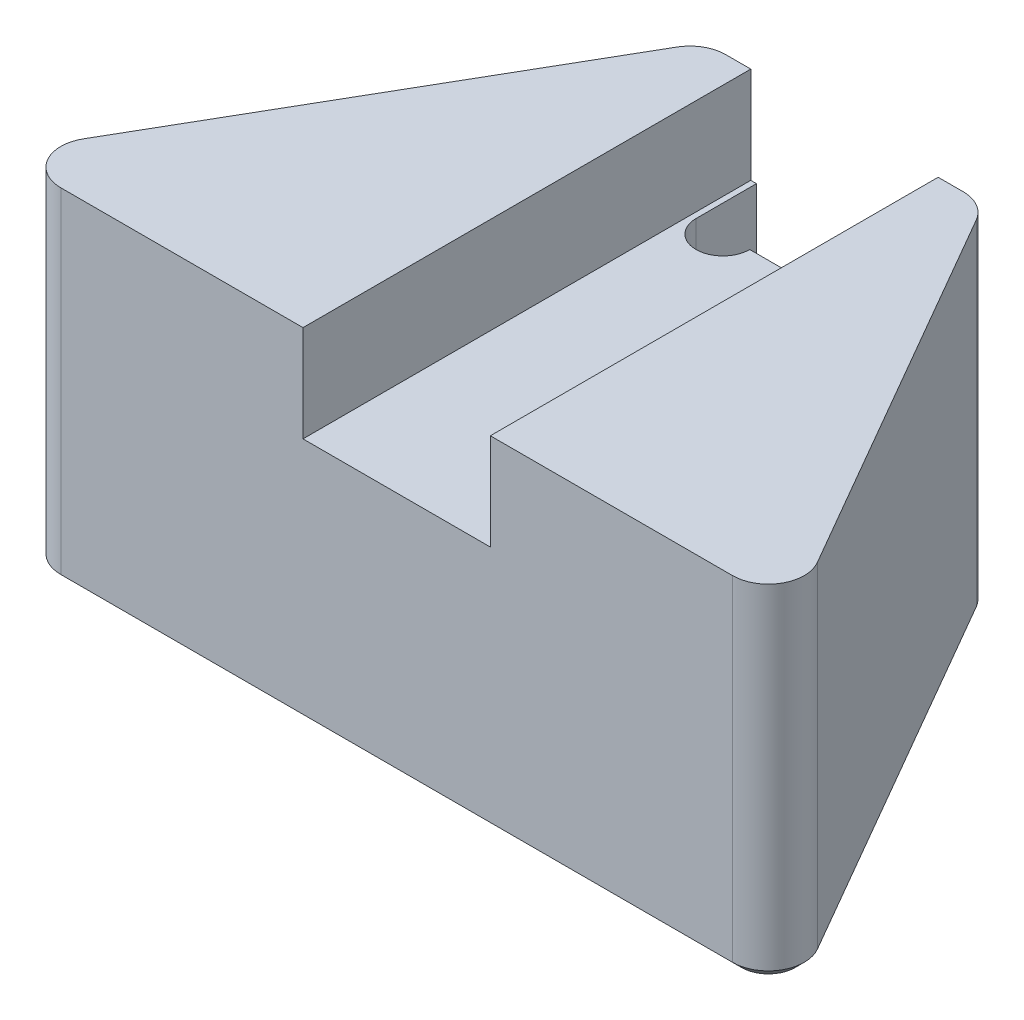
ISO-10303-21;
HEADER;
FILE_DESCRIPTION(('STEP AP214'),'2;1');
FILE_NAME('part.step','',(''),(''),'','','');
FILE_SCHEMA(('AUTOMOTIVE_DESIGN { 1 0 10303 214 1 1 1 1 }'));
ENDSEC;
DATA;
#1=APPLICATION_CONTEXT('core data for automotive mechanical design processes');
#2=APPLICATION_PROTOCOL_DEFINITION('international standard','automotive_design',2000,#1);
#3=PRODUCT_CONTEXT('',#1,'mechanical');
#4=PRODUCT('Part','Part','',(#3));
#5=PRODUCT_RELATED_PRODUCT_CATEGORY('part','',(#4));
#6=PRODUCT_DEFINITION_FORMATION('','',#4);
#7=PRODUCT_DEFINITION_CONTEXT('part definition',#1,'design');
#8=PRODUCT_DEFINITION('design','',#6,#7);
#9=PRODUCT_DEFINITION_SHAPE('','',#8);
#10=(LENGTH_UNIT() NAMED_UNIT(*) SI_UNIT(.MILLI.,.METRE.));
#11=(NAMED_UNIT(*) PLANE_ANGLE_UNIT() SI_UNIT($,.RADIAN.));
#12=(NAMED_UNIT(*) SI_UNIT($,.STERADIAN.) SOLID_ANGLE_UNIT());
#13=UNCERTAINTY_MEASURE_WITH_UNIT(LENGTH_MEASURE(1.E-05),#10,'distance_accuracy_value','');
#14=(GEOMETRIC_REPRESENTATION_CONTEXT(3) GLOBAL_UNCERTAINTY_ASSIGNED_CONTEXT((#13)) GLOBAL_UNIT_ASSIGNED_CONTEXT((#10,
#11,#12)) REPRESENTATION_CONTEXT('',''));
#15=CARTESIAN_POINT('',(0.,0.,0.));
#16=DIRECTION('',(0.,0.,1.));
#17=DIRECTION('',(1.,0.,0.));
#18=AXIS2_PLACEMENT_3D('',#15,#16,#17);
#19=CARTESIAN_POINT('',(0.,9.6,0.));
#20=DIRECTION('',(0.,-1.,0.));
#21=DIRECTION('',(0.,0.,-1.));
#22=AXIS2_PLACEMENT_3D('',#19,#20,#21);
#23=PLANE('',#22);
#24=DIRECTION('',(1.,0.,0.));
#25=VECTOR('',#24,1.);
#26=CARTESIAN_POINT('',(-22.2168783648704,9.6,12.5));
#27=LINE('',#26,#25);
#28=CARTESIAN_POINT('',(-18.7527767497326,9.6,12.5));
#29=VERTEX_POINT('',#28);
#30=CARTESIAN_POINT('',(-5.23,9.6,12.5));
#31=VERTEX_POINT('',#30);
#32=EDGE_CURVE('E250',#29,#31,#27,.T.);
#33=ORIENTED_EDGE('',*,*,#32,.T.);
#34=DIRECTION('',(0.,0.,1.));
#35=VECTOR('',#34,1.);
#36=CARTESIAN_POINT('',(-5.23,9.6,-12.5));
#37=LINE('',#36,#35);
#38=CARTESIAN_POINT('',(-5.23,9.6,-12.5));
#39=VERTEX_POINT('',#38);
#40=EDGE_CURVE('E241',#39,#31,#37,.T.);
#41=ORIENTED_EDGE('',*,*,#40,.F.);
#42=DIRECTION('',(-1.,0.,0.));
#43=VECTOR('',#42,1.);
#44=CARTESIAN_POINT('',(-7.7831216351296,9.6,-12.5));
#45=LINE('',#44,#43);
#46=CARTESIAN_POINT('',(-6.62842109675035,9.6,-12.5));
#47=VERTEX_POINT('',#46);
#48=EDGE_CURVE('E256',#39,#47,#45,.T.);
#49=ORIENTED_EDGE('',*,*,#48,.T.);
#50=CARTESIAN_POINT('',(-6.62842109675035,9.6,-10.5));
#51=DIRECTION('',(0.,-1.,0.));
#52=DIRECTION('',(0.,0.,-1.));
#53=AXIS2_PLACEMENT_3D('',#50,#51,#52);
#54=CIRCLE('',#53,2.);
#55=CARTESIAN_POINT('',(-8.36047190431923,9.6,-11.5));
#56=VERTEX_POINT('',#55);
#57=EDGE_CURVE('E277',#47,#56,#54,.F.);
#58=ORIENTED_EDGE('',*,*,#57,.T.);
#59=DIRECTION('',(-0.500000000000004,0.,0.866025403784436));
#60=VECTOR('',#59,1.);
#61=CARTESIAN_POINT('',(-7.7831216351296,9.6,-12.5));
#62=LINE('',#61,#60);
#63=CARTESIAN_POINT('',(-20.4848275573015,9.6,9.49999999999999));
#64=VERTEX_POINT('',#63);
#65=EDGE_CURVE('E260',#56,#64,#62,.T.);
#66=ORIENTED_EDGE('',*,*,#65,.T.);
#67=CARTESIAN_POINT('',(-18.7527767497326,9.6,10.5));
#68=DIRECTION('',(0.,-1.,0.));
#69=DIRECTION('',(0.,0.,-1.));
#70=AXIS2_PLACEMENT_3D('',#67,#68,#69);
#71=CIRCLE('',#70,2.);
#72=EDGE_CURVE('E271',#64,#29,#71,.F.);
#73=ORIENTED_EDGE('',*,*,#72,.T.);
#74=EDGE_LOOP('',(#33,#41,#49,#58,#66,#73));
#75=FACE_BOUND('',#74,.T.);
#76=ADVANCED_FACE('F37',(#75),#23,.F.);
#77=CARTESIAN_POINT('',(22.2168783648704,9.6,12.5));
#78=DIRECTION('',(0.,0.,-1.));
#79=DIRECTION('',(-1.,0.,0.));
#80=AXIS2_PLACEMENT_3D('',#77,#78,#79);
#81=PLANE('',#80);
#82=DIRECTION('',(0.,-1.,0.));
#83=VECTOR('',#82,1.);
#84=CARTESIAN_POINT('',(-18.7527767497326,9.6,12.5));
#85=LINE('',#84,#83);
#86=CARTESIAN_POINT('',(-18.7527767497326,-9.1,12.5));
#87=VERTEX_POINT('',#86);
#88=EDGE_CURVE('E284',#29,#87,#85,.T.);
#89=ORIENTED_EDGE('',*,*,#88,.T.);
#90=DIRECTION('',(1.,0.,0.));
#91=VECTOR('',#90,1.);
#92=CARTESIAN_POINT('',(18.7527767497326,-9.1,12.5));
#93=LINE('',#92,#91);
#94=CARTESIAN_POINT('',(18.7527767497326,-9.1,12.5));
#95=VERTEX_POINT('',#94);
#96=EDGE_CURVE('E313',#87,#95,#93,.T.);
#97=ORIENTED_EDGE('',*,*,#96,.T.);
#98=DIRECTION('',(0.,-1.,0.));
#99=VECTOR('',#98,1.);
#100=CARTESIAN_POINT('',(18.7527767497326,9.6,12.5));
#101=LINE('',#100,#99);
#102=CARTESIAN_POINT('',(18.7527767497326,9.6,12.5));
#103=VERTEX_POINT('',#102);
#104=EDGE_CURVE('E287',#95,#103,#101,.F.);
#105=ORIENTED_EDGE('',*,*,#104,.T.);
#106=CARTESIAN_POINT('',(5.23,9.6,12.5));
#107=VERTEX_POINT('',#106);
#108=EDGE_CURVE('E243',#107,#103,#27,.T.);
#109=ORIENTED_EDGE('',*,*,#108,.F.);
#110=DIRECTION('',(0.,1.,0.));
#111=VECTOR('',#110,1.);
#112=CARTESIAN_POINT('',(5.23,9.6,12.5));
#113=LINE('',#112,#111);
#114=CARTESIAN_POINT('',(5.23,4.22,12.5));
#115=VERTEX_POINT('',#114);
#116=EDGE_CURVE('E228',#115,#107,#113,.T.);
#117=ORIENTED_EDGE('',*,*,#116,.F.);
#118=DIRECTION('',(1.,0.,0.));
#119=VECTOR('',#118,1.);
#120=CARTESIAN_POINT('',(-5.23,4.22,12.5));
#121=LINE('',#120,#119);
#122=CARTESIAN_POINT('',(-5.23,4.22,12.5));
#123=VERTEX_POINT('',#122);
#124=EDGE_CURVE('E237',#123,#115,#121,.T.);
#125=ORIENTED_EDGE('',*,*,#124,.F.);
#126=DIRECTION('',(0.,-1.,0.));
#127=VECTOR('',#126,1.);
#128=CARTESIAN_POINT('',(-5.23,9.6,12.5));
#129=LINE('',#128,#127);
#130=EDGE_CURVE('E217',#31,#123,#129,.T.);
#131=ORIENTED_EDGE('',*,*,#130,.F.);
#132=ORIENTED_EDGE('',*,*,#32,.F.);
#133=EDGE_LOOP('',(#89,#97,#105,#109,#117,#125,#131,#132));
#134=FACE_BOUND('',#133,.T.);
#135=ADVANCED_FACE('F416',(#134),#81,.F.);
#136=CARTESIAN_POINT('',(7.7831216351296,9.6,-12.5));
#137=DIRECTION('',(-0.866025403784436,0.,0.500000000000004));
#138=DIRECTION('',(0.500000000000004,0.,0.866025403784436));
#139=AXIS2_PLACEMENT_3D('',#136,#137,#138);
#140=PLANE('',#139);
#141=DIRECTION('',(0.,-1.,0.));
#142=VECTOR('',#141,1.);
#143=CARTESIAN_POINT('',(20.4848275573015,9.6,9.5));
#144=LINE('',#143,#142);
#145=CARTESIAN_POINT('',(20.4848275573015,9.6,9.49999999999999));
#146=VERTEX_POINT('',#145);
#147=CARTESIAN_POINT('',(20.4848275573015,-9.1,9.5));
#148=VERTEX_POINT('',#147);
#149=EDGE_CURVE('E279',#146,#148,#144,.T.);
#150=ORIENTED_EDGE('',*,*,#149,.T.);
#151=DIRECTION('',(-0.500000000000004,0.,-0.866025403784436));
#152=VECTOR('',#151,1.);
#153=CARTESIAN_POINT('',(8.36047190431923,-9.1,-11.5));
#154=LINE('',#153,#152);
#155=CARTESIAN_POINT('',(8.36047190431923,-9.1,-11.5));
#156=VERTEX_POINT('',#155);
#157=EDGE_CURVE('E317',#148,#156,#154,.T.);
#158=ORIENTED_EDGE('',*,*,#157,.T.);
#159=DIRECTION('',(0.,-1.,0.));
#160=VECTOR('',#159,1.);
#161=CARTESIAN_POINT('',(8.36047190431923,9.6,-11.5));
#162=LINE('',#161,#160);
#163=CARTESIAN_POINT('',(8.36047190431923,9.6,-11.5));
#164=VERTEX_POINT('',#163);
#165=EDGE_CURVE('E282',#156,#164,#162,.F.);
#166=ORIENTED_EDGE('',*,*,#165,.T.);
#167=DIRECTION('',(-0.500000000000004,0.,-0.866025403784436));
#168=VECTOR('',#167,1.);
#169=CARTESIAN_POINT('',(7.7831216351296,9.6,-12.5));
#170=LINE('',#169,#168);
#171=EDGE_CURVE('E253',#146,#164,#170,.T.);
#172=ORIENTED_EDGE('',*,*,#171,.F.);
#173=EDGE_LOOP('',(#150,#158,#166,#172));
#174=FACE_BOUND('',#173,.T.);
#175=ADVANCED_FACE('F369',(#174),#140,.F.);
#176=CARTESIAN_POINT('',(-7.7831216351296,9.6,-12.5));
#177=DIRECTION('',(0.,0.,1.));
#178=DIRECTION('',(1.,0.,0.));
#179=AXIS2_PLACEMENT_3D('',#176,#177,#178);
#180=PLANE('',#179);
#181=DIRECTION('',(0.,-1.,0.));
#182=VECTOR('',#181,1.);
#183=CARTESIAN_POINT('',(6.62842109675036,9.6,-12.5));
#184=LINE('',#183,#182);
#185=CARTESIAN_POINT('',(6.62842109675036,9.6,-12.5));
#186=VERTEX_POINT('',#185);
#187=CARTESIAN_POINT('',(6.62842109675036,-9.1,-12.5));
#188=VERTEX_POINT('',#187);
#189=EDGE_CURVE('E267',#186,#188,#184,.T.);
#190=ORIENTED_EDGE('',*,*,#189,.T.);
#191=DIRECTION('',(-1.,0.,0.));
#192=VECTOR('',#191,1.);
#193=CARTESIAN_POINT('',(-6.62842109675035,-9.1,-12.5));
#194=LINE('',#193,#192);
#195=CARTESIAN_POINT('',(-6.62842109675035,-9.1,-12.5));
#196=VERTEX_POINT('',#195);
#197=EDGE_CURVE('E61',#188,#196,#194,.T.);
#198=ORIENTED_EDGE('',*,*,#197,.T.);
#199=DIRECTION('',(0.,-1.,0.));
#200=VECTOR('',#199,1.);
#201=CARTESIAN_POINT('',(-6.62842109675035,9.6,-12.5));
#202=LINE('',#201,#200);
#203=EDGE_CURVE('E269',#196,#47,#202,.F.);
#204=ORIENTED_EDGE('',*,*,#203,.T.);
#205=ORIENTED_EDGE('',*,*,#48,.F.);
#206=DIRECTION('',(0.,-1.,0.));
#207=VECTOR('',#206,1.);
#208=CARTESIAN_POINT('',(-5.23,9.6,-12.5));
#209=LINE('',#208,#207);
#210=CARTESIAN_POINT('',(-5.23,4.22,-12.5));
#211=VERTEX_POINT('',#210);
#212=EDGE_CURVE('E224',#39,#211,#209,.T.);
#213=ORIENTED_EDGE('',*,*,#212,.T.);
#214=DIRECTION('',(1.,0.,0.));
#215=VECTOR('',#214,1.);
#216=CARTESIAN_POINT('',(-5.23,4.22,-12.5));
#217=LINE('',#216,#215);
#218=CARTESIAN_POINT('',(-4.9125,4.22,-12.5));
#219=VERTEX_POINT('',#218);
#220=EDGE_CURVE('E229',#211,#219,#217,.T.);
#221=ORIENTED_EDGE('',*,*,#220,.T.);
#222=DIRECTION('',(0.,1.,0.));
#223=VECTOR('',#222,1.);
#224=CARTESIAN_POINT('',(-4.9125,4.22,-12.5));
#225=LINE('',#224,#223);
#226=CARTESIAN_POINT('',(-4.9125,-5.605,-12.5));
#227=VERTEX_POINT('',#226);
#228=EDGE_CURVE('E213',#227,#219,#225,.T.);
#229=ORIENTED_EDGE('',*,*,#228,.F.);
#230=DIRECTION('',(-1.,0.,0.));
#231=VECTOR('',#230,1.);
#232=CARTESIAN_POINT('',(4.9125,-5.60499999999998,-12.5));
#233=LINE('',#232,#231);
#234=CARTESIAN_POINT('',(4.9125,-5.60499999999998,-12.5));
#235=VERTEX_POINT('',#234);
#236=EDGE_CURVE('E497',#235,#227,#233,.T.);
#237=ORIENTED_EDGE('',*,*,#236,.F.);
#238=DIRECTION('',(0.,-1.,0.));
#239=VECTOR('',#238,1.);
#240=CARTESIAN_POINT('',(4.9125,4.22,-12.5));
#241=LINE('',#240,#239);
#242=CARTESIAN_POINT('',(4.9125,4.22,-12.5));
#243=VERTEX_POINT('',#242);
#244=EDGE_CURVE('E494',#243,#235,#241,.T.);
#245=ORIENTED_EDGE('',*,*,#244,.F.);
#246=CARTESIAN_POINT('',(5.23,4.22,-12.5));
#247=VERTEX_POINT('',#246);
#248=EDGE_CURVE('E227',#243,#247,#217,.T.);
#249=ORIENTED_EDGE('',*,*,#248,.T.);
#250=DIRECTION('',(0.,1.,0.));
#251=VECTOR('',#250,1.);
#252=CARTESIAN_POINT('',(5.23,9.6,-12.5));
#253=LINE('',#252,#251);
#254=CARTESIAN_POINT('',(5.23,9.6,-12.5));
#255=VERTEX_POINT('',#254);
#256=EDGE_CURVE('E231',#247,#255,#253,.T.);
#257=ORIENTED_EDGE('',*,*,#256,.T.);
#258=EDGE_CURVE('E257',#186,#255,#45,.T.);
#259=ORIENTED_EDGE('',*,*,#258,.F.);
#260=EDGE_LOOP('',(#190,#198,#204,#205,#213,#221,#229,#237,#245,#249,#257,#259));
#261=FACE_BOUND('',#260,.T.);
#262=ADVANCED_FACE('F359',(#261),#180,.F.);
#263=CARTESIAN_POINT('',(-7.7831216351296,9.6,-12.5));
#264=DIRECTION('',(0.866025403784436,0.,0.500000000000004));
#265=DIRECTION('',(0.500000000000004,0.,-0.866025403784436));
#266=AXIS2_PLACEMENT_3D('',#263,#264,#265);
#267=PLANE('',#266);
#268=DIRECTION('',(0.,-1.,0.));
#269=VECTOR('',#268,1.);
#270=CARTESIAN_POINT('',(-8.36047190431923,9.6,-11.5));
#271=LINE('',#270,#269);
#272=CARTESIAN_POINT('',(-8.36047190431923,-9.1,-11.5));
#273=VERTEX_POINT('',#272);
#274=EDGE_CURVE('E265',#56,#273,#271,.T.);
#275=ORIENTED_EDGE('',*,*,#274,.T.);
#276=DIRECTION('',(-0.500000000000004,0.,0.866025403784436));
#277=VECTOR('',#276,1.);
#278=CARTESIAN_POINT('',(-20.4848275573015,-9.1,9.49999999999999));
#279=LINE('',#278,#277);
#280=CARTESIAN_POINT('',(-20.4848275573015,-9.1,9.49999999999999));
#281=VERTEX_POINT('',#280);
#282=EDGE_CURVE('E11',#273,#281,#279,.T.);
#283=ORIENTED_EDGE('',*,*,#282,.T.);
#284=DIRECTION('',(0.,-1.,0.));
#285=VECTOR('',#284,1.);
#286=CARTESIAN_POINT('',(-20.4848275573015,9.6,9.49999999999999));
#287=LINE('',#286,#285);
#288=EDGE_CURVE('E263',#281,#64,#287,.F.);
#289=ORIENTED_EDGE('',*,*,#288,.T.);
#290=ORIENTED_EDGE('',*,*,#65,.F.);
#291=EDGE_LOOP('',(#275,#283,#289,#290));
#292=FACE_BOUND('',#291,.T.);
#293=ADVANCED_FACE('F399',(#292),#267,.F.);
#294=ORIENTED_EDGE('',*,*,#258,.T.);
#295=DIRECTION('',(0.,0.,1.));
#296=VECTOR('',#295,1.);
#297=CARTESIAN_POINT('',(5.23,9.6,-12.5));
#298=LINE('',#297,#296);
#299=EDGE_CURVE('E244',#255,#107,#298,.T.);
#300=ORIENTED_EDGE('',*,*,#299,.T.);
#301=ORIENTED_EDGE('',*,*,#108,.T.);
#302=CARTESIAN_POINT('',(18.7527767497326,9.6,10.5));
#303=DIRECTION('',(0.,-1.,0.));
#304=DIRECTION('',(0.,0.,-1.));
#305=AXIS2_PLACEMENT_3D('',#302,#303,#304);
#306=CIRCLE('',#305,2.);
#307=EDGE_CURVE('E273',#103,#146,#306,.F.);
#308=ORIENTED_EDGE('',*,*,#307,.T.);
#309=ORIENTED_EDGE('',*,*,#171,.T.);
#310=CARTESIAN_POINT('',(6.62842109675036,9.6,-10.5));
#311=DIRECTION('',(0.,-1.,0.));
#312=DIRECTION('',(0.,0.,-1.));
#313=AXIS2_PLACEMENT_3D('',#310,#311,#312);
#314=CIRCLE('',#313,2.);
#315=EDGE_CURVE('E275',#164,#186,#314,.F.);
#316=ORIENTED_EDGE('',*,*,#315,.T.);
#317=EDGE_LOOP('',(#294,#300,#301,#308,#309,#316));
#318=FACE_BOUND('',#317,.T.);
#319=ADVANCED_FACE('F362',(#318),#23,.F.);
#320=CARTESIAN_POINT('',(0.,-9.6,0.));
#321=DIRECTION('',(0.,-1.,0.));
#322=DIRECTION('',(0.,0.,-1.));
#323=AXIS2_PLACEMENT_3D('',#320,#321,#322);
#324=PLANE('',#323);
#325=DIRECTION('',(-1.,0.,0.));
#326=VECTOR('',#325,1.);
#327=CARTESIAN_POINT('',(-18.7527767497326,-9.6,12.));
#328=LINE('',#327,#326);
#329=CARTESIAN_POINT('',(18.7527767497326,-9.6,12.));
#330=VERTEX_POINT('',#329);
#331=CARTESIAN_POINT('',(-18.7527767497326,-9.6,12.));
#332=VERTEX_POINT('',#331);
#333=EDGE_CURVE('E305',#330,#332,#328,.T.);
#334=ORIENTED_EDGE('',*,*,#333,.T.);
#335=CARTESIAN_POINT('',(-18.7527767497326,-9.6,10.5));
#336=DIRECTION('',(0.,-1.,0.));
#337=DIRECTION('',(0.,0.,-1.));
#338=AXIS2_PLACEMENT_3D('',#335,#336,#337);
#339=CIRCLE('',#338,1.5);
#340=CARTESIAN_POINT('',(-20.0518148554093,-9.6,9.74999999999999));
#341=VERTEX_POINT('',#340);
#342=EDGE_CURVE('E307',#332,#341,#339,.T.);
#343=ORIENTED_EDGE('',*,*,#342,.T.);
#344=DIRECTION('',(0.500000000000004,0.,-0.866025403784436));
#345=VECTOR('',#344,1.);
#346=CARTESIAN_POINT('',(-7.92745920242701,-9.6,-11.25));
#347=LINE('',#346,#345);
#348=CARTESIAN_POINT('',(-7.92745920242701,-9.6,-11.25));
#349=VERTEX_POINT('',#348);
#350=EDGE_CURVE('E293',#341,#349,#347,.T.);
#351=ORIENTED_EDGE('',*,*,#350,.T.);
#352=CARTESIAN_POINT('',(-6.62842109675035,-9.6,-10.5));
#353=DIRECTION('',(0.,-1.,0.));
#354=DIRECTION('',(0.,0.,-1.));
#355=AXIS2_PLACEMENT_3D('',#352,#353,#354);
#356=CIRCLE('',#355,1.5);
#357=CARTESIAN_POINT('',(-6.62842109675035,-9.6,-12.));
#358=VERTEX_POINT('',#357);
#359=EDGE_CURVE('E295',#349,#358,#356,.T.);
#360=ORIENTED_EDGE('',*,*,#359,.T.);
#361=DIRECTION('',(1.,0.,0.));
#362=VECTOR('',#361,1.);
#363=CARTESIAN_POINT('',(6.62842109675036,-9.6,-12.));
#364=LINE('',#363,#362);
#365=CARTESIAN_POINT('',(6.62842109675036,-9.6,-12.));
#366=VERTEX_POINT('',#365);
#367=EDGE_CURVE('E297',#358,#366,#364,.T.);
#368=ORIENTED_EDGE('',*,*,#367,.T.);
#369=CARTESIAN_POINT('',(6.62842109675036,-9.6,-10.5));
#370=DIRECTION('',(0.,-1.,0.));
#371=DIRECTION('',(0.,0.,-1.));
#372=AXIS2_PLACEMENT_3D('',#369,#370,#371);
#373=CIRCLE('',#372,1.5);
#374=CARTESIAN_POINT('',(7.92745920242701,-9.6,-11.25));
#375=VERTEX_POINT('',#374);
#376=EDGE_CURVE('E299',#366,#375,#373,.T.);
#377=ORIENTED_EDGE('',*,*,#376,.T.);
#378=DIRECTION('',(0.500000000000004,0.,0.866025403784437));
#379=VECTOR('',#378,1.);
#380=CARTESIAN_POINT('',(20.0518148554093,-9.6,9.74999999999999));
#381=LINE('',#380,#379);
#382=CARTESIAN_POINT('',(20.0518148554093,-9.6,9.75));
#383=VERTEX_POINT('',#382);
#384=EDGE_CURVE('E301',#375,#383,#381,.T.);
#385=ORIENTED_EDGE('',*,*,#384,.T.);
#386=CARTESIAN_POINT('',(18.7527767497326,-9.6,10.5));
#387=DIRECTION('',(0.,-1.,0.));
#388=DIRECTION('',(0.,0.,-1.));
#389=AXIS2_PLACEMENT_3D('',#386,#387,#388);
#390=CIRCLE('',#389,1.5);
#391=EDGE_CURVE('E303',#383,#330,#390,.T.);
#392=ORIENTED_EDGE('',*,*,#391,.T.);
#393=EDGE_LOOP('',(#334,#343,#351,#360,#368,#377,#385,#392));
#394=FACE_BOUND('',#393,.T.);
#395=ADVANCED_FACE('F385',(#394),#324,.T.);
#396=CARTESIAN_POINT('',(-6.62842109675035,9.6,-10.5));
#397=DIRECTION('',(0.,-1.,0.));
#398=DIRECTION('',(0.,0.,-1.));
#399=AXIS2_PLACEMENT_3D('',#396,#397,#398);
#400=CYLINDRICAL_SURFACE('',#399,2.);
#401=ORIENTED_EDGE('',*,*,#203,.F.);
#402=CARTESIAN_POINT('',(-6.62842109675035,-9.1,-10.5));
#403=DIRECTION('',(0.,-1.,0.));
#404=DIRECTION('',(0.,0.,-1.));
#405=AXIS2_PLACEMENT_3D('',#402,#403,#404);
#406=CIRCLE('',#405,2.);
#407=EDGE_CURVE('E46',#196,#273,#406,.F.);
#408=ORIENTED_EDGE('',*,*,#407,.T.);
#409=ORIENTED_EDGE('',*,*,#274,.F.);
#410=ORIENTED_EDGE('',*,*,#57,.F.);
#411=EDGE_LOOP('',(#401,#408,#409,#410));
#412=FACE_BOUND('',#411,.T.);
#413=ADVANCED_FACE('F431',(#412),#400,.T.);
#414=CARTESIAN_POINT('',(6.62842109675036,9.6,-10.5));
#415=DIRECTION('',(0.,-1.,0.));
#416=DIRECTION('',(0.,0.,-1.));
#417=AXIS2_PLACEMENT_3D('',#414,#415,#416);
#418=CYLINDRICAL_SURFACE('',#417,2.);
#419=ORIENTED_EDGE('',*,*,#165,.F.);
#420=CARTESIAN_POINT('',(6.62842109675036,-9.1,-10.5));
#421=DIRECTION('',(0.,-1.,0.));
#422=DIRECTION('',(0.,0.,-1.));
#423=AXIS2_PLACEMENT_3D('',#420,#421,#422);
#424=CIRCLE('',#423,2.);
#425=EDGE_CURVE('E319',#156,#188,#424,.F.);
#426=ORIENTED_EDGE('',*,*,#425,.T.);
#427=ORIENTED_EDGE('',*,*,#189,.F.);
#428=ORIENTED_EDGE('',*,*,#315,.F.);
#429=EDGE_LOOP('',(#419,#426,#427,#428));
#430=FACE_BOUND('',#429,.T.);
#431=ADVANCED_FACE('F356',(#430),#418,.T.);
#432=CARTESIAN_POINT('',(18.7527767497326,9.6,10.5));
#433=DIRECTION('',(0.,-1.,0.));
#434=DIRECTION('',(0.,0.,-1.));
#435=AXIS2_PLACEMENT_3D('',#432,#433,#434);
#436=CYLINDRICAL_SURFACE('',#435,2.);
#437=ORIENTED_EDGE('',*,*,#104,.F.);
#438=CARTESIAN_POINT('',(18.7527767497326,-9.1,10.5));
#439=DIRECTION('',(0.,-1.,0.));
#440=DIRECTION('',(0.,0.,-1.));
#441=AXIS2_PLACEMENT_3D('',#438,#439,#440);
#442=CIRCLE('',#441,2.);
#443=EDGE_CURVE('E315',#95,#148,#442,.F.);
#444=ORIENTED_EDGE('',*,*,#443,.T.);
#445=ORIENTED_EDGE('',*,*,#149,.F.);
#446=ORIENTED_EDGE('',*,*,#307,.F.);
#447=EDGE_LOOP('',(#437,#444,#445,#446));
#448=FACE_BOUND('',#447,.T.);
#449=ADVANCED_FACE('F372',(#448),#436,.T.);
#450=CARTESIAN_POINT('',(-18.7527767497326,9.6,10.5));
#451=DIRECTION('',(0.,-1.,0.));
#452=DIRECTION('',(0.,0.,-1.));
#453=AXIS2_PLACEMENT_3D('',#450,#451,#452);
#454=CYLINDRICAL_SURFACE('',#453,2.);
#455=ORIENTED_EDGE('',*,*,#288,.F.);
#456=CARTESIAN_POINT('',(-18.7527767497326,-9.1,10.5));
#457=DIRECTION('',(0.,-1.,0.));
#458=DIRECTION('',(0.,0.,-1.));
#459=AXIS2_PLACEMENT_3D('',#456,#457,#458);
#460=CIRCLE('',#459,2.);
#461=EDGE_CURVE('E310',#281,#87,#460,.F.);
#462=ORIENTED_EDGE('',*,*,#461,.T.);
#463=ORIENTED_EDGE('',*,*,#88,.F.);
#464=ORIENTED_EDGE('',*,*,#72,.F.);
#465=EDGE_LOOP('',(#455,#462,#463,#464));
#466=FACE_BOUND('',#465,.T.);
#467=ADVANCED_FACE('F404',(#466),#454,.T.);
#468=CARTESIAN_POINT('',(-5.23,9.6,-12.5));
#469=DIRECTION('',(-1.,0.,0.));
#470=DIRECTION('',(0.,-1.,0.));
#471=AXIS2_PLACEMENT_3D('',#468,#469,#470);
#472=PLANE('',#471);
#473=ORIENTED_EDGE('',*,*,#130,.T.);
#474=DIRECTION('',(0.,0.,1.));
#475=VECTOR('',#474,1.);
#476=CARTESIAN_POINT('',(-5.23,4.22,-12.5));
#477=LINE('',#476,#475);
#478=EDGE_CURVE('E234',#211,#123,#477,.T.);
#479=ORIENTED_EDGE('',*,*,#478,.F.);
#480=ORIENTED_EDGE('',*,*,#212,.F.);
#481=ORIENTED_EDGE('',*,*,#40,.T.);
#482=EDGE_LOOP('',(#473,#479,#480,#481));
#483=FACE_BOUND('',#482,.T.);
#484=ADVANCED_FACE('F446',(#483),#472,.F.);
#485=CARTESIAN_POINT('',(5.23,9.6,-12.5));
#486=DIRECTION('',(1.,0.,0.));
#487=DIRECTION('',(0.,0.,-1.));
#488=AXIS2_PLACEMENT_3D('',#485,#486,#487);
#489=PLANE('',#488);
#490=ORIENTED_EDGE('',*,*,#116,.T.);
#491=ORIENTED_EDGE('',*,*,#299,.F.);
#492=ORIENTED_EDGE('',*,*,#256,.F.);
#493=DIRECTION('',(0.,0.,1.));
#494=VECTOR('',#493,1.);
#495=CARTESIAN_POINT('',(5.23,4.22,-12.5));
#496=LINE('',#495,#494);
#497=EDGE_CURVE('E247',#247,#115,#496,.T.);
#498=ORIENTED_EDGE('',*,*,#497,.T.);
#499=EDGE_LOOP('',(#490,#491,#492,#498));
#500=FACE_BOUND('',#499,.T.);
#501=ADVANCED_FACE('F450',(#500),#489,.F.);
#502=CARTESIAN_POINT('',(-5.23,4.22,-12.5));
#503=DIRECTION('',(0.,-1.,0.));
#504=DIRECTION('',(1.,0.,0.));
#505=AXIS2_PLACEMENT_3D('',#502,#503,#504);
#506=PLANE('',#505);
#507=DIRECTION('',(0.,0.,-1.));
#508=VECTOR('',#507,1.);
#509=CARTESIAN_POINT('',(4.9125,4.22,-9.125));
#510=LINE('',#509,#508);
#511=CARTESIAN_POINT('',(4.9125,4.22,-9.125));
#512=VERTEX_POINT('',#511);
#513=EDGE_CURVE('E214',#512,#243,#510,.T.);
#514=ORIENTED_EDGE('',*,*,#513,.F.);
#515=CARTESIAN_POINT('',(3.4125,4.22,-9.125));
#516=DIRECTION('',(0.,1.,0.));
#517=DIRECTION('',(-1.,0.,0.));
#518=AXIS2_PLACEMENT_3D('',#515,#516,#517);
#519=CIRCLE('',#518,1.5);
#520=CARTESIAN_POINT('',(1.9125,4.22,-9.125));
#521=VERTEX_POINT('',#520);
#522=EDGE_CURVE('E483',#521,#512,#519,.T.);
#523=ORIENTED_EDGE('',*,*,#522,.F.);
#524=DIRECTION('',(1.,0.,0.));
#525=VECTOR('',#524,1.);
#526=CARTESIAN_POINT('',(4.9125,4.22,-9.125));
#527=LINE('',#526,#525);
#528=CARTESIAN_POINT('',(-1.9125,4.22,-9.125));
#529=VERTEX_POINT('',#528);
#530=EDGE_CURVE('E197',#529,#521,#527,.T.);
#531=ORIENTED_EDGE('',*,*,#530,.F.);
#532=CARTESIAN_POINT('',(-3.4125,4.22,-9.125));
#533=DIRECTION('',(0.,1.,0.));
#534=DIRECTION('',(-1.,0.,0.));
#535=AXIS2_PLACEMENT_3D('',#532,#533,#534);
#536=CIRCLE('',#535,1.5);
#537=CARTESIAN_POINT('',(-4.9125,4.22,-9.125));
#538=VERTEX_POINT('',#537);
#539=EDGE_CURVE('E190',#538,#529,#536,.T.);
#540=ORIENTED_EDGE('',*,*,#539,.F.);
#541=DIRECTION('',(0.,0.,-1.));
#542=VECTOR('',#541,1.);
#543=CARTESIAN_POINT('',(-4.9125,4.22,-9.125));
#544=LINE('',#543,#542);
#545=EDGE_CURVE('E206',#538,#219,#544,.T.);
#546=ORIENTED_EDGE('',*,*,#545,.T.);
#547=ORIENTED_EDGE('',*,*,#220,.F.);
#548=ORIENTED_EDGE('',*,*,#478,.T.);
#549=ORIENTED_EDGE('',*,*,#124,.T.);
#550=ORIENTED_EDGE('',*,*,#497,.F.);
#551=ORIENTED_EDGE('',*,*,#248,.F.);
#552=EDGE_LOOP('',(#514,#523,#531,#540,#546,#547,#548,#549,#550,#551));
#553=FACE_BOUND('',#552,.T.);
#554=ADVANCED_FACE('F204',(#553),#506,.F.);
#555=CARTESIAN_POINT('',(4.9125,4.22,-9.125));
#556=DIRECTION('',(1.,0.,0.));
#557=DIRECTION('',(0.,0.,-1.));
#558=AXIS2_PLACEMENT_3D('',#555,#556,#557);
#559=PLANE('',#558);
#560=ORIENTED_EDGE('',*,*,#244,.T.);
#561=DIRECTION('',(0.,0.,-1.));
#562=VECTOR('',#561,1.);
#563=CARTESIAN_POINT('',(4.9125,-5.60499999999998,-9.125));
#564=LINE('',#563,#562);
#565=CARTESIAN_POINT('',(4.9125,-5.60499999999998,-9.125));
#566=VERTEX_POINT('',#565);
#567=EDGE_CURVE('E219',#566,#235,#564,.T.);
#568=ORIENTED_EDGE('',*,*,#567,.F.);
#569=DIRECTION('',(0.,-1.,0.));
#570=VECTOR('',#569,1.);
#571=CARTESIAN_POINT('',(4.9125,4.22,-9.125));
#572=LINE('',#571,#570);
#573=EDGE_CURVE('E499',#512,#566,#572,.T.);
#574=ORIENTED_EDGE('',*,*,#573,.F.);
#575=ORIENTED_EDGE('',*,*,#513,.T.);
#576=EDGE_LOOP('',(#560,#568,#574,#575));
#577=FACE_BOUND('',#576,.T.);
#578=ADVANCED_FACE('F459',(#577),#559,.F.);
#579=CARTESIAN_POINT('',(-4.9125,4.22,-9.125));
#580=DIRECTION('',(-1.,0.,0.));
#581=DIRECTION('',(0.,0.,1.));
#582=AXIS2_PLACEMENT_3D('',#579,#580,#581);
#583=PLANE('',#582);
#584=ORIENTED_EDGE('',*,*,#228,.T.);
#585=ORIENTED_EDGE('',*,*,#545,.F.);
#586=DIRECTION('',(0.,1.,0.));
#587=VECTOR('',#586,1.);
#588=CARTESIAN_POINT('',(-4.9125,4.22,-9.125));
#589=LINE('',#588,#587);
#590=CARTESIAN_POINT('',(-4.9125,-5.605,-9.125));
#591=VERTEX_POINT('',#590);
#592=EDGE_CURVE('E187',#591,#538,#589,.T.);
#593=ORIENTED_EDGE('',*,*,#592,.F.);
#594=DIRECTION('',(0.,0.,-1.));
#595=VECTOR('',#594,1.);
#596=CARTESIAN_POINT('',(-4.9125,-5.605,-9.125));
#597=LINE('',#596,#595);
#598=EDGE_CURVE('E215',#591,#227,#597,.T.);
#599=ORIENTED_EDGE('',*,*,#598,.T.);
#600=EDGE_LOOP('',(#584,#585,#593,#599));
#601=FACE_BOUND('',#600,.T.);
#602=ADVANCED_FACE('F211',(#601),#583,.F.);
#603=CARTESIAN_POINT('',(4.9125,-5.60499999999998,-9.125));
#604=DIRECTION('',(0.,-1.,0.));
#605=DIRECTION('',(1.,0.,0.));
#606=AXIS2_PLACEMENT_3D('',#603,#604,#605);
#607=PLANE('',#606);
#608=DIRECTION('',(-1.,0.,0.));
#609=VECTOR('',#608,1.);
#610=CARTESIAN_POINT('',(4.9125,-5.60499999999998,-9.125));
#611=LINE('',#610,#609);
#612=CARTESIAN_POINT('',(1.9125,-5.60499999999999,-9.125));
#613=VERTEX_POINT('',#612);
#614=CARTESIAN_POINT('',(-1.9125,-5.60499999999999,-9.125));
#615=VERTEX_POINT('',#614);
#616=EDGE_CURVE('E198',#613,#615,#611,.T.);
#617=ORIENTED_EDGE('',*,*,#616,.F.);
#618=CARTESIAN_POINT('',(3.4125,-5.60499999999999,-9.125));
#619=DIRECTION('',(0.,-1.,0.));
#620=DIRECTION('',(1.,0.,0.));
#621=AXIS2_PLACEMENT_3D('',#618,#619,#620);
#622=CIRCLE('',#621,1.5);
#623=EDGE_CURVE('E486',#613,#566,#622,.F.);
#624=ORIENTED_EDGE('',*,*,#623,.T.);
#625=ORIENTED_EDGE('',*,*,#567,.T.);
#626=ORIENTED_EDGE('',*,*,#236,.T.);
#627=ORIENTED_EDGE('',*,*,#598,.F.);
#628=CARTESIAN_POINT('',(-3.4125,-5.605,-9.125));
#629=DIRECTION('',(0.,-1.,0.));
#630=DIRECTION('',(1.,0.,0.));
#631=AXIS2_PLACEMENT_3D('',#628,#629,#630);
#632=CIRCLE('',#631,1.5);
#633=EDGE_CURVE('E193',#591,#615,#632,.F.);
#634=ORIENTED_EDGE('',*,*,#633,.T.);
#635=EDGE_LOOP('',(#617,#624,#625,#626,#627,#634));
#636=FACE_BOUND('',#635,.T.);
#637=ADVANCED_FACE('F464',(#636),#607,.F.);
#638=CARTESIAN_POINT('',(0.,0.,-9.125));
#639=DIRECTION('',(0.,0.,-1.));
#640=DIRECTION('',(-1.,0.,0.));
#641=AXIS2_PLACEMENT_3D('',#638,#639,#640);
#642=PLANE('',#641);
#643=DIRECTION('',(0.,1.,0.));
#644=VECTOR('',#643,1.);
#645=CARTESIAN_POINT('',(1.9125,-9.84764068711928,-9.125));
#646=LINE('',#645,#644);
#647=EDGE_CURVE('E291',#613,#521,#646,.T.);
#648=ORIENTED_EDGE('',*,*,#647,.F.);
#649=ORIENTED_EDGE('',*,*,#616,.T.);
#650=DIRECTION('',(0.,1.,0.));
#651=VECTOR('',#650,1.);
#652=CARTESIAN_POINT('',(-1.9125,-9.84764068711928,-9.125));
#653=LINE('',#652,#651);
#654=EDGE_CURVE('E289',#529,#615,#653,.F.);
#655=ORIENTED_EDGE('',*,*,#654,.F.);
#656=ORIENTED_EDGE('',*,*,#530,.T.);
#657=EDGE_LOOP('',(#648,#649,#655,#656));
#658=FACE_BOUND('',#657,.T.);
#659=ADVANCED_FACE('F467',(#658),#642,.T.);
#660=CARTESIAN_POINT('',(-3.4125,-9.84764068711928,-9.125));
#661=DIRECTION('',(0.,1.,0.));
#662=DIRECTION('',(-1.,0.,0.));
#663=AXIS2_PLACEMENT_3D('',#660,#661,#662);
#664=CYLINDRICAL_SURFACE('',#663,1.5);
#665=ORIENTED_EDGE('',*,*,#592,.T.);
#666=ORIENTED_EDGE('',*,*,#539,.T.);
#667=ORIENTED_EDGE('',*,*,#654,.T.);
#668=ORIENTED_EDGE('',*,*,#633,.F.);
#669=EDGE_LOOP('',(#665,#666,#667,#668));
#670=FACE_BOUND('',#669,.T.);
#671=ADVANCED_FACE('F189',(#670),#664,.F.);
#672=CARTESIAN_POINT('',(3.4125,-9.84764068711928,-9.125));
#673=DIRECTION('',(0.,1.,0.));
#674=DIRECTION('',(-1.,0.,0.));
#675=AXIS2_PLACEMENT_3D('',#672,#673,#674);
#676=CYLINDRICAL_SURFACE('',#675,1.5);
#677=ORIENTED_EDGE('',*,*,#647,.T.);
#678=ORIENTED_EDGE('',*,*,#522,.T.);
#679=ORIENTED_EDGE('',*,*,#573,.T.);
#680=ORIENTED_EDGE('',*,*,#623,.F.);
#681=EDGE_LOOP('',(#677,#678,#679,#680));
#682=FACE_BOUND('',#681,.T.);
#683=ADVANCED_FACE('F476',(#682),#676,.F.);
#684=CARTESIAN_POINT('',(6.62842109675036,-9.6,-10.5));
#685=DIRECTION('',(0.,1.,0.));
#686=DIRECTION('',(0.,0.,1.));
#687=AXIS2_PLACEMENT_3D('',#684,#685,#686);
#688=CONICAL_SURFACE('',#687,1.5,0.785398163397452);
#689=DIRECTION('',(0.,-0.707106781186545,0.70710678118655));
#690=VECTOR('',#689,1.);
#691=CARTESIAN_POINT('',(6.62842109675036,-9.1,-12.5));
#692=LINE('',#691,#690);
#693=EDGE_CURVE('E338',#188,#366,#692,.T.);
#694=ORIENTED_EDGE('',*,*,#693,.F.);
#695=ORIENTED_EDGE('',*,*,#425,.F.);
#696=DIRECTION('',(0.612372435695794,0.707106781186546,-0.353553390593278));
#697=VECTOR('',#696,1.);
#698=CARTESIAN_POINT('',(7.92745920242701,-9.6,-11.25));
#699=LINE('',#698,#697);
#700=EDGE_CURVE('E41',#375,#156,#699,.T.);
#701=ORIENTED_EDGE('',*,*,#700,.F.);
#702=ORIENTED_EDGE('',*,*,#376,.F.);
#703=EDGE_LOOP('',(#694,#695,#701,#702));
#704=FACE_BOUND('',#703,.T.);
#705=ADVANCED_FACE('F39',(#704),#688,.T.);
#706=CARTESIAN_POINT('',(7.7831216351296,-9.1,-12.5));
#707=DIRECTION('',(0.612372435695792,-0.707106781186549,-0.353553390593276));
#708=DIRECTION('',(0.500000000000004,0.,0.866025403784436));
#709=AXIS2_PLACEMENT_3D('',#706,#707,#708);
#710=PLANE('',#709);
#711=ORIENTED_EDGE('',*,*,#700,.T.);
#712=ORIENTED_EDGE('',*,*,#157,.F.);
#713=DIRECTION('',(0.612372435695794,0.707106781186546,-0.353553390593278));
#714=VECTOR('',#713,1.);
#715=CARTESIAN_POINT('',(20.0518148554093,-9.6,9.75));
#716=LINE('',#715,#714);
#717=EDGE_CURVE('E336',#383,#148,#716,.T.);
#718=ORIENTED_EDGE('',*,*,#717,.F.);
#719=ORIENTED_EDGE('',*,*,#384,.F.);
#720=EDGE_LOOP('',(#711,#712,#718,#719));
#721=FACE_BOUND('',#720,.T.);
#722=ADVANCED_FACE('F348',(#721),#710,.T.);
#723=CARTESIAN_POINT('',(-7.7831216351296,-9.1,-12.5));
#724=DIRECTION('',(0.,-0.70710678118655,-0.707106781186545));
#725=DIRECTION('',(1.,0.,0.));
#726=AXIS2_PLACEMENT_3D('',#723,#724,#725);
#727=PLANE('',#726);
#728=ORIENTED_EDGE('',*,*,#693,.T.);
#729=ORIENTED_EDGE('',*,*,#367,.F.);
#730=DIRECTION('',(0.,-0.707106781186545,0.70710678118655));
#731=VECTOR('',#730,1.);
#732=CARTESIAN_POINT('',(-6.62842109675035,-9.1,-12.5));
#733=LINE('',#732,#731);
#734=EDGE_CURVE('E333',#196,#358,#733,.T.);
#735=ORIENTED_EDGE('',*,*,#734,.F.);
#736=ORIENTED_EDGE('',*,*,#197,.F.);
#737=EDGE_LOOP('',(#728,#729,#735,#736));
#738=FACE_BOUND('',#737,.T.);
#739=ADVANCED_FACE('F388',(#738),#727,.T.);
#740=CARTESIAN_POINT('',(18.7527767497326,-9.6,10.5));
#741=DIRECTION('',(0.,1.,0.));
#742=DIRECTION('',(0.,0.,1.));
#743=AXIS2_PLACEMENT_3D('',#740,#741,#742);
#744=CONICAL_SURFACE('',#743,1.5,0.78539816339745);
#745=ORIENTED_EDGE('',*,*,#717,.T.);
#746=ORIENTED_EDGE('',*,*,#443,.F.);
#747=DIRECTION('',(0.,0.707106781186546,0.707106781186549));
#748=VECTOR('',#747,1.);
#749=CARTESIAN_POINT('',(18.7527767497326,-9.6,12.));
#750=LINE('',#749,#748);
#751=EDGE_CURVE('E330',#330,#95,#750,.T.);
#752=ORIENTED_EDGE('',*,*,#751,.F.);
#753=ORIENTED_EDGE('',*,*,#391,.F.);
#754=EDGE_LOOP('',(#745,#746,#752,#753));
#755=FACE_BOUND('',#754,.T.);
#756=ADVANCED_FACE('F376',(#755),#744,.T.);
#757=CARTESIAN_POINT('',(-6.62842109675035,-9.6,-10.5));
#758=DIRECTION('',(0.,1.,0.));
#759=DIRECTION('',(0.,0.,1.));
#760=AXIS2_PLACEMENT_3D('',#757,#758,#759);
#761=CONICAL_SURFACE('',#760,1.5,0.785398163397452);
#762=ORIENTED_EDGE('',*,*,#734,.T.);
#763=ORIENTED_EDGE('',*,*,#359,.F.);
#764=DIRECTION('',(0.612372435695796,-0.707106781186545,0.353553390593277));
#765=VECTOR('',#764,1.);
#766=CARTESIAN_POINT('',(-8.36047190431923,-9.1,-11.5));
#767=LINE('',#766,#765);
#768=EDGE_CURVE('E327',#273,#349,#767,.T.);
#769=ORIENTED_EDGE('',*,*,#768,.F.);
#770=ORIENTED_EDGE('',*,*,#407,.F.);
#771=EDGE_LOOP('',(#762,#763,#769,#770));
#772=FACE_BOUND('',#771,.T.);
#773=ADVANCED_FACE('F390',(#772),#761,.T.);
#774=CARTESIAN_POINT('',(22.2168783648704,-9.1,12.5));
#775=DIRECTION('',(0.,-0.70710678118655,0.707106781186545));
#776=DIRECTION('',(-1.,0.,0.));
#777=AXIS2_PLACEMENT_3D('',#774,#775,#776);
#778=PLANE('',#777);
#779=ORIENTED_EDGE('',*,*,#751,.T.);
#780=ORIENTED_EDGE('',*,*,#96,.F.);
#781=DIRECTION('',(0.,0.707106781186545,0.70710678118655));
#782=VECTOR('',#781,1.);
#783=CARTESIAN_POINT('',(-18.7527767497326,-9.6,12.));
#784=LINE('',#783,#782);
#785=EDGE_CURVE('E325',#332,#87,#784,.T.);
#786=ORIENTED_EDGE('',*,*,#785,.F.);
#787=ORIENTED_EDGE('',*,*,#333,.F.);
#788=EDGE_LOOP('',(#779,#780,#786,#787));
#789=FACE_BOUND('',#788,.T.);
#790=ADVANCED_FACE('F381',(#789),#778,.T.);
#791=CARTESIAN_POINT('',(-7.7831216351296,-9.1,-12.5));
#792=DIRECTION('',(-0.61237243569579,-0.707106781186551,-0.353553390593275));
#793=DIRECTION('',(0.500000000000004,0.,-0.866025403784436));
#794=AXIS2_PLACEMENT_3D('',#791,#792,#793);
#795=PLANE('',#794);
#796=ORIENTED_EDGE('',*,*,#768,.T.);
#797=ORIENTED_EDGE('',*,*,#350,.F.);
#798=DIRECTION('',(0.612372435695794,-0.707106781186546,0.353553390593278));
#799=VECTOR('',#798,1.);
#800=CARTESIAN_POINT('',(-20.4848275573015,-9.1,9.49999999999999));
#801=LINE('',#800,#799);
#802=EDGE_CURVE('E323',#281,#341,#801,.T.);
#803=ORIENTED_EDGE('',*,*,#802,.F.);
#804=ORIENTED_EDGE('',*,*,#282,.F.);
#805=EDGE_LOOP('',(#796,#797,#803,#804));
#806=FACE_BOUND('',#805,.T.);
#807=ADVANCED_FACE('F396',(#806),#795,.T.);
#808=CARTESIAN_POINT('',(-18.7527767497326,-9.6,10.5));
#809=DIRECTION('',(0.,1.,0.));
#810=DIRECTION('',(0.,0.,1.));
#811=AXIS2_PLACEMENT_3D('',#808,#809,#810);
#812=CONICAL_SURFACE('',#811,1.5,0.785398163397452);
#813=ORIENTED_EDGE('',*,*,#785,.T.);
#814=ORIENTED_EDGE('',*,*,#461,.F.);
#815=ORIENTED_EDGE('',*,*,#802,.T.);
#816=ORIENTED_EDGE('',*,*,#342,.F.);
#817=EDGE_LOOP('',(#813,#814,#815,#816));
#818=FACE_BOUND('',#817,.T.);
#819=ADVANCED_FACE('F407',(#818),#812,.T.);
#820=CLOSED_SHELL('',(#76,#135,#175,#262,#293,#319,#395,#413,#431,#449,#467,#484,#501,#554,#578,
#602,#637,#659,#671,#683,#705,#722,#739,#756,#773,#790,#807,#819));
#821=MANIFOLD_SOLID_BREP('B2',#820);
#822=ADVANCED_BREP_SHAPE_REPRESENTATION('',(#18,#821),#14);
#823=SHAPE_DEFINITION_REPRESENTATION(#9,#822);
ENDSEC;
END-ISO-10303-21;
